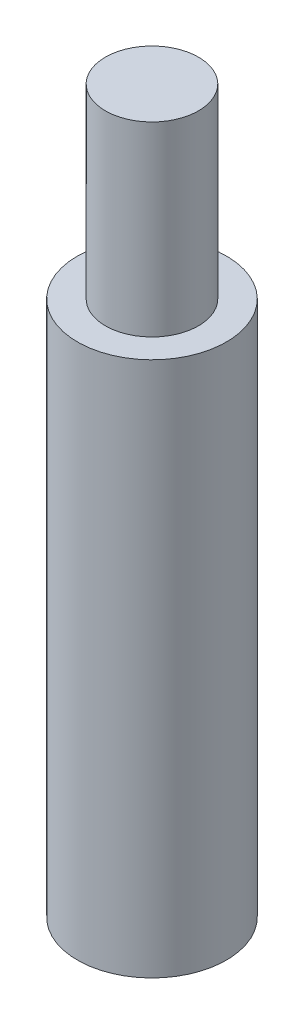
ISO-10303-21;
HEADER;
FILE_DESCRIPTION(('STEP AP214'),'2;1');
FILE_NAME('part.step','',(''),(''),'','','');
FILE_SCHEMA(('AUTOMOTIVE_DESIGN { 1 0 10303 214 1 1 1 1 }'));
ENDSEC;
DATA;
#1=APPLICATION_CONTEXT('core data for automotive mechanical design processes');
#2=APPLICATION_PROTOCOL_DEFINITION('international standard','automotive_design',2000,#1);
#3=PRODUCT_CONTEXT('',#1,'mechanical');
#4=PRODUCT('Part','Part','',(#3));
#5=PRODUCT_RELATED_PRODUCT_CATEGORY('part','',(#4));
#6=PRODUCT_DEFINITION_FORMATION('','',#4);
#7=PRODUCT_DEFINITION_CONTEXT('part definition',#1,'design');
#8=PRODUCT_DEFINITION('design','',#6,#7);
#9=PRODUCT_DEFINITION_SHAPE('','',#8);
#10=(LENGTH_UNIT() NAMED_UNIT(*) SI_UNIT(.MILLI.,.METRE.));
#11=(NAMED_UNIT(*) PLANE_ANGLE_UNIT() SI_UNIT($,.RADIAN.));
#12=(NAMED_UNIT(*) SI_UNIT($,.STERADIAN.) SOLID_ANGLE_UNIT());
#13=UNCERTAINTY_MEASURE_WITH_UNIT(LENGTH_MEASURE(1.E-05),#10,'distance_accuracy_value','');
#14=(GEOMETRIC_REPRESENTATION_CONTEXT(3) GLOBAL_UNCERTAINTY_ASSIGNED_CONTEXT((#13)) GLOBAL_UNIT_ASSIGNED_CONTEXT((#10,
#11,#12)) REPRESENTATION_CONTEXT('',''));
#15=CARTESIAN_POINT('',(0.,0.,0.));
#16=DIRECTION('',(0.,0.,1.));
#17=DIRECTION('',(1.,0.,0.));
#18=AXIS2_PLACEMENT_3D('',#15,#16,#17);
#19=CARTESIAN_POINT('',(0.,-11.5,0.));
#20=DIRECTION('',(0.,1.,0.));
#21=DIRECTION('',(-1.,0.,0.));
#22=AXIS2_PLACEMENT_3D('',#19,#20,#21);
#23=PLANE('',#22);
#24=CARTESIAN_POINT('',(0.,-11.5,0.));
#25=DIRECTION('',(0.,1.,0.));
#26=DIRECTION('',(-1.,0.,0.));
#27=AXIS2_PLACEMENT_3D('',#24,#25,#26);
#28=CIRCLE('',#27,1.05);
#29=CARTESIAN_POINT('',(-1.05,-11.5,0.));
#30=VERTEX_POINT('',#29);
#31=EDGE_CURVE('E10',#30,#30,#28,.T.);
#32=ORIENTED_EDGE('',*,*,#31,.F.);
#33=EDGE_LOOP('',(#32));
#34=FACE_BOUND('',#33,.T.);
#35=ADVANCED_FACE('F40',(#34),#23,.F.);
#36=CARTESIAN_POINT('',(0.,0.,0.));
#37=DIRECTION('',(0.,1.,0.));
#38=DIRECTION('',(-1.,0.,0.));
#39=AXIS2_PLACEMENT_3D('',#36,#37,#38);
#40=CYLINDRICAL_SURFACE('',#39,1.05);
#41=CARTESIAN_POINT('',(0.,-15.5,0.));
#42=DIRECTION('',(0.,1.,0.));
#43=DIRECTION('',(-1.,0.,0.));
#44=AXIS2_PLACEMENT_3D('',#41,#42,#43);
#45=CIRCLE('',#44,1.05);
#46=CARTESIAN_POINT('',(-1.05,-15.5,0.));
#47=VERTEX_POINT('',#46);
#48=EDGE_CURVE('E46',#47,#47,#45,.T.);
#49=ORIENTED_EDGE('',*,*,#48,.F.);
#50=EDGE_LOOP('',(#49));
#51=FACE_BOUND('',#50,.T.);
#52=ORIENTED_EDGE('',*,*,#31,.T.);
#53=EDGE_LOOP('',(#52));
#54=FACE_BOUND('',#53,.T.);
#55=ADVANCED_FACE('F88',(#51,#54),#40,.F.);
#56=CARTESIAN_POINT('',(1.6,-15.5,0.));
#57=DIRECTION('',(0.,1.,0.));
#58=DIRECTION('',(-1.,0.,0.));
#59=AXIS2_PLACEMENT_3D('',#56,#57,#58);
#60=PLANE('',#59);
#61=CARTESIAN_POINT('',(0.,-15.5,0.));
#62=DIRECTION('',(0.,1.,0.));
#63=DIRECTION('',(-1.,0.,0.));
#64=AXIS2_PLACEMENT_3D('',#61,#62,#63);
#65=CIRCLE('',#64,1.6);
#66=CARTESIAN_POINT('',(-1.59999999999999,-15.5,0.));
#67=VERTEX_POINT('',#66);
#68=EDGE_CURVE('E50',#67,#67,#65,.T.);
#69=ORIENTED_EDGE('',*,*,#68,.F.);
#70=EDGE_LOOP('',(#69));
#71=FACE_BOUND('',#70,.T.);
#72=ORIENTED_EDGE('',*,*,#48,.T.);
#73=EDGE_LOOP('',(#72));
#74=FACE_BOUND('',#73,.T.);
#75=ADVANCED_FACE('F83',(#71,#74),#60,.F.);
#76=CARTESIAN_POINT('',(0.,0.,0.));
#77=DIRECTION('',(0.,1.,0.));
#78=DIRECTION('',(-1.,0.,0.));
#79=AXIS2_PLACEMENT_3D('',#76,#77,#78);
#80=CYLINDRICAL_SURFACE('',#79,1.6);
#81=CARTESIAN_POINT('',(0.,-4.,0.));
#82=DIRECTION('',(0.,1.,0.));
#83=DIRECTION('',(-1.,0.,0.));
#84=AXIS2_PLACEMENT_3D('',#81,#82,#83);
#85=CIRCLE('',#84,1.6);
#86=CARTESIAN_POINT('',(-1.6,-4.,0.));
#87=VERTEX_POINT('',#86);
#88=EDGE_CURVE('E54',#87,#87,#85,.T.);
#89=ORIENTED_EDGE('',*,*,#88,.F.);
#90=EDGE_LOOP('',(#89));
#91=FACE_BOUND('',#90,.T.);
#92=ORIENTED_EDGE('',*,*,#68,.T.);
#93=EDGE_LOOP('',(#92));
#94=FACE_BOUND('',#93,.T.);
#95=ADVANCED_FACE('F77',(#91,#94),#80,.T.);
#96=CARTESIAN_POINT('',(1.,-4.,0.));
#97=DIRECTION('',(0.,-1.,0.));
#98=DIRECTION('',(1.,0.,0.));
#99=AXIS2_PLACEMENT_3D('',#96,#97,#98);
#100=PLANE('',#99);
#101=CARTESIAN_POINT('',(0.,-4.,0.));
#102=DIRECTION('',(0.,1.,0.));
#103=DIRECTION('',(-1.,0.,0.));
#104=AXIS2_PLACEMENT_3D('',#101,#102,#103);
#105=CIRCLE('',#104,1.);
#106=CARTESIAN_POINT('',(-1.,-4.,0.));
#107=VERTEX_POINT('',#106);
#108=EDGE_CURVE('E59',#107,#107,#105,.T.);
#109=ORIENTED_EDGE('',*,*,#108,.F.);
#110=EDGE_LOOP('',(#109));
#111=FACE_BOUND('',#110,.T.);
#112=ORIENTED_EDGE('',*,*,#88,.T.);
#113=EDGE_LOOP('',(#112));
#114=FACE_BOUND('',#113,.T.);
#115=ADVANCED_FACE('F71',(#111,#114),#100,.F.);
#116=CARTESIAN_POINT('',(0.,0.,0.));
#117=DIRECTION('',(0.,1.,0.));
#118=DIRECTION('',(-1.,0.,0.));
#119=AXIS2_PLACEMENT_3D('',#116,#117,#118);
#120=CYLINDRICAL_SURFACE('',#119,1.);
#121=CARTESIAN_POINT('',(0.,0.,0.));
#122=DIRECTION('',(0.,1.,0.));
#123=DIRECTION('',(-1.,0.,0.));
#124=AXIS2_PLACEMENT_3D('',#121,#122,#123);
#125=CIRCLE('',#124,1.);
#126=CARTESIAN_POINT('',(-1.,0.,0.));
#127=VERTEX_POINT('',#126);
#128=EDGE_CURVE('E62',#127,#127,#125,.T.);
#129=ORIENTED_EDGE('',*,*,#128,.F.);
#130=EDGE_LOOP('',(#129));
#131=FACE_BOUND('',#130,.T.);
#132=ORIENTED_EDGE('',*,*,#108,.T.);
#133=EDGE_LOOP('',(#132));
#134=FACE_BOUND('',#133,.T.);
#135=ADVANCED_FACE('F68',(#131,#134),#120,.T.);
#136=CARTESIAN_POINT('',(0.,0.,0.));
#137=DIRECTION('',(0.,-1.,0.));
#138=DIRECTION('',(1.,0.,0.));
#139=AXIS2_PLACEMENT_3D('',#136,#137,#138);
#140=PLANE('',#139);
#141=ORIENTED_EDGE('',*,*,#128,.T.);
#142=EDGE_LOOP('',(#141));
#143=FACE_BOUND('',#142,.T.);
#144=ADVANCED_FACE('F66',(#143),#140,.F.);
#145=CLOSED_SHELL('',(#35,#55,#75,#95,#115,#135,#144));
#146=MANIFOLD_SOLID_BREP('B2',#145);
#147=ADVANCED_BREP_SHAPE_REPRESENTATION('',(#18,#146),#14);
#148=SHAPE_DEFINITION_REPRESENTATION(#9,#147);
ENDSEC;
END-ISO-10303-21;
